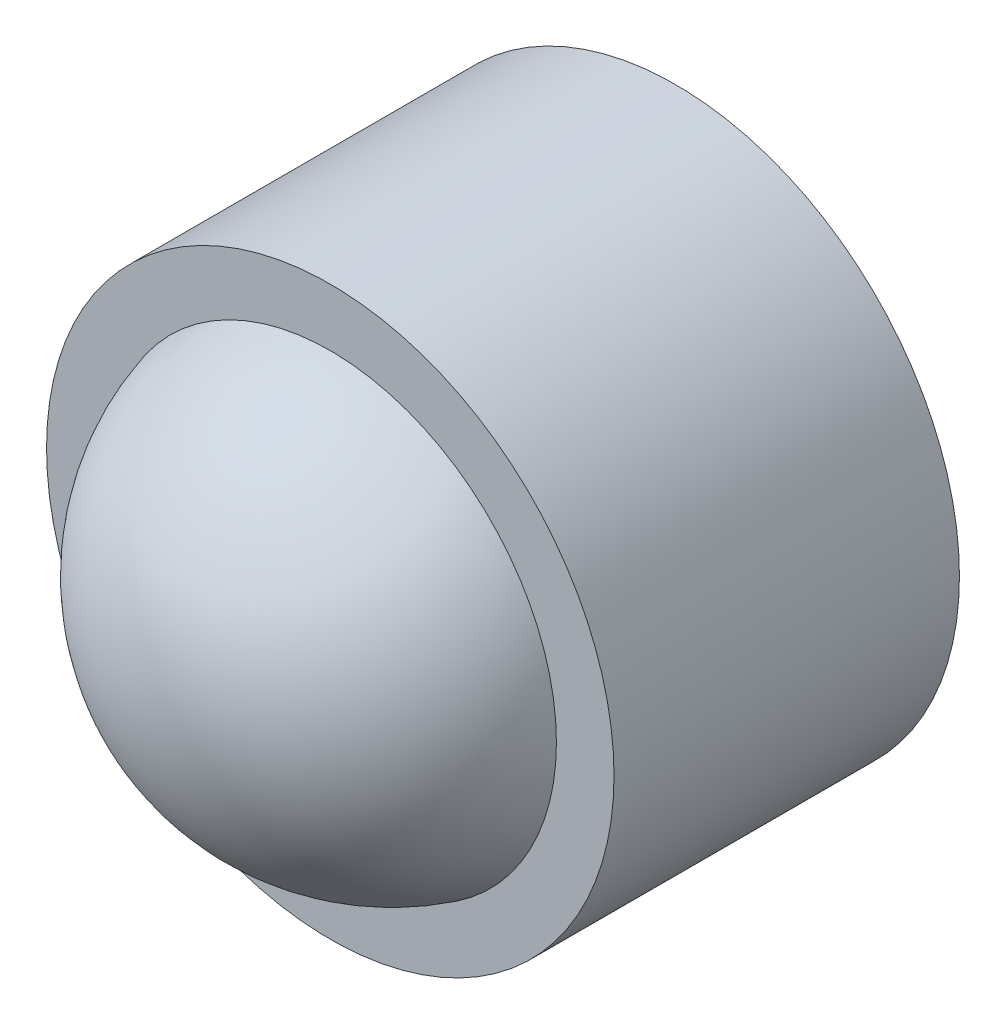
ISO-10303-21;
HEADER;
FILE_DESCRIPTION(('STEP AP214'),'2;1');
FILE_NAME('part.step','',(''),(''),'','','');
FILE_SCHEMA(('AUTOMOTIVE_DESIGN { 1 0 10303 214 1 1 1 1 }'));
ENDSEC;
DATA;
#1=APPLICATION_CONTEXT('core data for automotive mechanical design processes');
#2=APPLICATION_PROTOCOL_DEFINITION('international standard','automotive_design',2000,#1);
#3=PRODUCT_CONTEXT('',#1,'mechanical');
#4=PRODUCT('Part','Part','',(#3));
#5=PRODUCT_RELATED_PRODUCT_CATEGORY('part','',(#4));
#6=PRODUCT_DEFINITION_FORMATION('','',#4);
#7=PRODUCT_DEFINITION_CONTEXT('part definition',#1,'design');
#8=PRODUCT_DEFINITION('design','',#6,#7);
#9=PRODUCT_DEFINITION_SHAPE('','',#8);
#10=(LENGTH_UNIT() NAMED_UNIT(*) SI_UNIT(.MILLI.,.METRE.));
#11=(NAMED_UNIT(*) PLANE_ANGLE_UNIT() SI_UNIT($,.RADIAN.));
#12=(NAMED_UNIT(*) SI_UNIT($,.STERADIAN.) SOLID_ANGLE_UNIT());
#13=UNCERTAINTY_MEASURE_WITH_UNIT(LENGTH_MEASURE(1.E-05),#10,'distance_accuracy_value','');
#14=(GEOMETRIC_REPRESENTATION_CONTEXT(3) GLOBAL_UNCERTAINTY_ASSIGNED_CONTEXT((#13)) GLOBAL_UNIT_ASSIGNED_CONTEXT((#10,
#11,#12)) REPRESENTATION_CONTEXT('',''));
#15=CARTESIAN_POINT('',(0.,0.,0.));
#16=DIRECTION('',(0.,0.,1.));
#17=DIRECTION('',(1.,0.,0.));
#18=AXIS2_PLACEMENT_3D('',#15,#16,#17);
#19=CARTESIAN_POINT('',(8.,0.,14.));
#20=DIRECTION('',(0.,0.,-1.));
#21=DIRECTION('',(-1.,0.,0.));
#22=AXIS2_PLACEMENT_3D('',#19,#20,#21);
#23=CYLINDRICAL_SURFACE('',#22,1.);
#24=CARTESIAN_POINT('',(7.26614909429952,-0.679310646424684,5.41792688495915));
#25=CARTESIAN_POINT('',(7.23726780048955,-0.648112009411069,5.37993831193802));
#26=CARTESIAN_POINT('',(7.20935422207309,-0.613983687752235,5.34358089975345));
#27=CARTESIAN_POINT('',(7.15663596354548,-0.539277748680729,5.2754533024846));
#28=CARTESIAN_POINT('',(7.13182787479878,-0.498707315227192,5.24367808198344));
#29=CARTESIAN_POINT('',(7.09248645265815,-0.421666163807222,5.19359974926243));
#30=CARTESIAN_POINT('',(7.0769259052674,-0.386634560230069,5.17390438939157));
#31=CARTESIAN_POINT('',(7.04943241987194,-0.312984544177243,5.13923100197879));
#32=CARTESIAN_POINT('',(7.03749441362285,-0.27437124255281,5.1242463826412));
#33=CARTESIAN_POINT('',(7.01963813902374,-0.200290996100601,5.10188336563008));
#34=CARTESIAN_POINT('',(7.01308509177327,-0.16522236443783,5.09370064851561));
#35=CARTESIAN_POINT('',(7.00376084453511,-0.0938142404546288,5.08206720860586));
#36=CARTESIAN_POINT('',(7.00098764560793,-0.0574754302941476,5.07861398465509));
#37=CARTESIAN_POINT('',(6.99945321245175,0.0154844581887679,5.07670258044163));
#38=CARTESIAN_POINT('',(7.00069902267907,0.0521059197717665,5.07825317078781));
#39=CARTESIAN_POINT('',(7.00710991874158,0.124457913408874,5.08624473894219));
#40=CARTESIAN_POINT('',(7.01227625675077,0.160188157051061,5.09268727918647));
#41=CARTESIAN_POINT('',(7.0259973684854,0.229208763859698,5.10984249934711));
#42=CARTESIAN_POINT('',(7.03449081033247,0.262531032579709,5.12047790940096));
#43=CARTESIAN_POINT('',(7.05432668093742,0.326859686755468,5.14540098706284));
#44=CARTESIAN_POINT('',(7.06567024656096,0.357865141655611,5.15969011211567));
#45=CARTESIAN_POINT('',(7.09721303966084,0.43288623393439,5.19958998102426));
#46=CARTESIAN_POINT('',(7.1189363012805,0.475195188435896,5.22720780004272));
#47=CARTESIAN_POINT('',(7.16602516955042,0.553708544014347,5.28755159482906));
#48=CARTESIAN_POINT('',(7.19140010460618,0.589896778001268,5.32029067236299));
#49=CARTESIAN_POINT('',(7.25844522202304,0.674035353806611,5.40757568515001));
#50=CARTESIAN_POINT('',(7.301680441207,0.718196561427157,5.46455136869222));
#51=CARTESIAN_POINT('',(7.39074804835355,0.795162867632641,5.58378395988812));
#52=CARTESIAN_POINT('',(7.43658489969596,0.827947718872208,5.646050040639));
#53=CARTESIAN_POINT('',(7.5208017755078,0.878820076903156,5.76241170371914));
#54=CARTESIAN_POINT('',(7.55902762702011,0.898494416338718,5.81594279134575));
#55=CARTESIAN_POINT('',(7.63557174828479,0.932169351904064,5.92471353304836));
#56=CARTESIAN_POINT('',(7.67389006067481,0.94616641865268,5.97995422703906));
#57=CARTESIAN_POINT('',(7.78852838559625,0.980651175793512,6.14780093609773));
#58=CARTESIAN_POINT('',(7.86438343391884,0.993549960290183,6.26232758355151));
#59=CARTESIAN_POINT('',(7.99399892328887,1.00151948879127,6.46476710627935));
#60=CARTESIAN_POINT('',(8.04851477719859,1.00026049030754,6.55212275899683));
#61=CARTESIAN_POINT('',(8.15524081618739,0.989333352913162,6.72780414440994));
#62=CARTESIAN_POINT('',(8.20744951356073,0.979659868957322,6.81613045846976));
#63=CARTESIAN_POINT('',(8.30899401352151,0.952511474221279,6.99290619963588));
#64=CARTESIAN_POINT('',(8.35833685228148,0.935056669965352,7.08135472747223));
#65=CARTESIAN_POINT('',(8.45396169973278,0.892556819047089,7.25801906095499));
#66=CARTESIAN_POINT('',(8.5002457107127,0.867516798784979,7.34623498181044));
#67=CARTESIAN_POINT('',(8.58397059947568,0.813113485508138,7.51096495494644));
#68=CARTESIAN_POINT('',(8.62179891735037,0.784660927670339,7.5875835827832));
#69=CARTESIAN_POINT('',(8.69472154200664,0.720920012373368,7.73964995193591));
#70=CARTESIAN_POINT('',(8.72980767873107,0.685612243722986,7.81509369523522));
#71=CARTESIAN_POINT('',(8.78010472008384,0.626190985006641,7.92652341433148));
#72=CARTESIAN_POINT('',(8.79657277892121,0.605162173935273,7.96359307598492));
#73=CARTESIAN_POINT('',(8.82852778012879,0.560620041924152,8.03663677632882));
#74=CARTESIAN_POINT('',(8.84401523241025,0.537108029494453,8.07261137930685));
#75=CARTESIAN_POINT('',(8.87377325799362,0.487197935070467,8.14279074543941));
#76=CARTESIAN_POINT('',(8.88804876941139,0.460812674830816,8.17700244281674));
#77=CARTESIAN_POINT('',(8.91512734029256,0.404378581309218,8.2428482788224));
#78=CARTESIAN_POINT('',(8.92793367476944,0.374338216716124,8.27448810272966));
#79=CARTESIAN_POINT('',(8.94838086311012,0.318141562535612,8.32566865150164));
#80=CARTESIAN_POINT('',(8.95649114792428,0.293066294198391,8.34619345292506));
#81=CARTESIAN_POINT('',(8.97117249844947,0.239956112815517,8.38365795725859));
#82=CARTESIAN_POINT('',(8.97774801626895,0.211930111421472,8.4006080157644));
#83=CARTESIAN_POINT('',(8.98690143053205,0.162572578579828,8.42434237468236));
#84=CARTESIAN_POINT('',(8.99008232822049,0.142088696484225,8.43263509677796));
#85=CARTESIAN_POINT('',(8.9952173356733,0.0999552008218125,8.44605697479058));
#86=CARTESIAN_POINT('',(8.99717289539629,0.0783069980896262,8.45118986964627));
#87=CARTESIAN_POINT('',(8.99966129917096,0.0341794902977633,8.45772600754511));
#88=CARTESIAN_POINT('',(9.00018285862771,0.0116949965308799,8.45909966760779));
#89=CARTESIAN_POINT('',(8.99970211226999,-0.0331450134664918,8.4578352389366));
#90=CARTESIAN_POINT('',(8.99869955678297,-0.0555005079627689,8.45519649291129));
#91=CARTESIAN_POINT('',(8.99546404506725,-0.0971943545942594,8.44670829609337));
#92=CARTESIAN_POINT('',(8.99336030572656,-0.116614621798573,8.44119624801359));
#93=CARTESIAN_POINT('',(8.98818863670166,-0.154427421353949,8.42769994900572));
#94=CARTESIAN_POINT('',(8.98512027261181,-0.172819486264193,8.41971458427709));
#95=CARTESIAN_POINT('',(8.97557519041553,-0.221977213806911,8.39499739798477));
#96=CARTESIAN_POINT('',(8.96827833227168,-0.251549398806938,8.37622500210386));
#97=CARTESIAN_POINT('',(8.95202586610275,-0.307406609875433,8.33487480178867));
#98=CARTESIAN_POINT('',(8.94306409761842,-0.333678799666818,8.31228289337112));
#99=CARTESIAN_POINT('',(8.92392296901234,-0.383509662607191,8.2646015169597));
#100=CARTESIAN_POINT('',(8.91373928077178,-0.407058073081229,8.23950322716801));
#101=CARTESIAN_POINT('',(8.8924452444782,-0.451835088845084,8.18766669679347));
#102=CARTESIAN_POINT('',(8.881333943276,-0.473061254922637,8.16092677704071));
#103=CARTESIAN_POINT('',(8.84683735907359,-0.533905339509559,8.07895102540735));
#104=CARTESIAN_POINT('',(8.82232097273286,-0.570612531770879,8.02203848933186));
#105=CARTESIAN_POINT('',(8.76756247426072,-0.642771438162312,7.89814546364919));
#106=CARTESIAN_POINT('',(8.7369937265833,-0.677390670967806,7.83084019725269));
#107=CARTESIAN_POINT('',(8.67333743816285,-0.740694656789546,7.69457601891092));
#108=CARTESIAN_POINT('',(8.64024718257557,-0.769372886173689,7.62561538096802));
#109=CARTESIAN_POINT('',(8.57179900714023,-0.82152121205503,7.4867663509803));
#110=CARTESIAN_POINT('',(8.53643857587696,-0.844985407883215,7.41687700172508));
#111=CARTESIAN_POINT('',(8.46366158812085,-0.887007566904843,7.27669207028179));
#112=CARTESIAN_POINT('',(8.42624479231107,-0.905564957584252,7.20639644166696));
#113=CARTESIAN_POINT('',(8.34518062380452,-0.939678913412032,7.05778937677553));
#114=CARTESIAN_POINT('',(8.30130670446102,-0.954660289025523,6.9794688156466));
#115=CARTESIAN_POINT('',(8.21141557470374,-0.978501852356758,6.82309202590976));
#116=CARTESIAN_POINT('',(8.16539769559516,-0.987360116465565,6.74503588802839));
#117=CARTESIAN_POINT('',(8.07153177774536,-0.998556404223144,6.58965206996921));
#118=CARTESIAN_POINT('',(8.02368574314308,-1.00090137140326,6.51232370169388));
#119=CARTESIAN_POINT('',(7.92649283018162,-0.99847798893105,6.35879256658678));
#120=CARTESIAN_POINT('',(7.87714674351371,-0.993713329841709,6.28258923648778));
#121=CARTESIAN_POINT('',(7.76198310862666,-0.973523463645757,6.10852946035286));
#122=CARTESIAN_POINT('',(7.69576343459159,-0.955272412911971,6.01121449055692));
#123=CARTESIAN_POINT('',(7.59644064354874,-0.915641366720048,5.86890690076534));
#124=CARTESIAN_POINT('',(7.56337539401584,-0.9004151956673,5.82213789457796));
#125=CARTESIAN_POINT('',(7.49754551509296,-0.865407688680087,5.730131722479));
#126=CARTESIAN_POINT('',(7.46478070114485,-0.845629375619061,5.68489356276644));
#127=CARTESIAN_POINT('',(7.40380618984153,-0.803590428765685,5.60164212900351));
#128=CARTESIAN_POINT('',(7.37551421749891,-0.781895872393073,5.56340514179757));
#129=CARTESIAN_POINT('',(7.31992622420529,-0.734060709929665,5.48896304833285));
#130=CARTESIAN_POINT('',(7.29263086173034,-0.70791722669042,5.45275927724717));
#131=CARTESIAN_POINT('',(7.26614909429952,-0.679310646424684,5.41792688495915));
#132=B_SPLINE_CURVE_WITH_KNOTS('',3,(#24,#25,#26,#27,#28,#29,#30,#31,#32,#33,#34,#35,#36,#37,
#38,#39,#40,#41,#42,#43,#44,#45,#46,#47,#48,#49,#50,#51,#52,#53,#54,#55,#56,#57,#58,#59,#60,#61,
#62,#63,#64,#65,#66,#67,#68,#69,#70,#71,#72,#73,#74,#75,#76,#77,#78,#79,#80,#81,#82,#83,#84,#85,
#86,#87,#88,#89,#90,#91,#92,#93,#94,#95,#96,#97,#98,#99,#100,#101,#102,#103,#104,#105,#106,#107,
#108,#109,#110,#111,#112,#113,#114,#115,#116,#117,#118,#119,#120,#121,#122,#123,#124,#125,#126,
#127,#128,#129,#130,#131),.UNSPECIFIED.,.T.,.F.,(4,2,2,2,2,2,2,2,2,2,2,2,2,2,2,2,2,2,2,2,2,2,2,
2,2,2,2,2,2,2,2,2,2,2,2,2,2,2,2,2,2,2,2,2,2,2,2,2,2,2,2,2,2,4),(0.,0.170942119162799,
0.341694932928776,0.470523566695406,0.599171118224239,0.70849918156759,0.817769405264902,
0.927231260092028,1.03672809056895,1.14429486079418,1.25190460587267,1.41596070854968,
1.58044359683964,1.83121638771323,2.08243323549472,2.2881194806978,2.49393339928046,
2.90634854210784,3.2149546093461,3.52375685244721,3.83176575048752,4.13957098895994,
4.40951200908113,4.68022884445586,4.81723115229697,4.95416162431265,5.09050431876862,
5.22653692368353,5.32651279213756,5.42619493890226,5.49294153687961,5.55960900282361,
5.62679961436731,5.69400123391237,5.75466378644214,5.81535369675566,5.92206708109958,
6.02918348569272,6.13669117220027,6.24431071866351,6.4598901972256,6.70445692571205,
6.94929079829991,7.19440035155034,7.43953849097725,7.71234782482906,7.98524282431974,
8.25784679092778,8.53030929972361,8.88649247794091,9.06414156698223,9.24167302586519,
9.39831118186806,9.55505102439682),.UNSPECIFIED.);
#133=CARTESIAN_POINT('',(7.26614909429952,-0.679310646424684,5.41792688495915));
#134=VERTEX_POINT('',#133);
#135=EDGE_CURVE('E10',#134,#134,#132,.T.);
#136=ORIENTED_EDGE('',*,*,#135,.F.);
#137=EDGE_LOOP('',(#136));
#138=FACE_BOUND('',#137,.T.);
#139=CARTESIAN_POINT('',(8.,0.,0.));
#140=DIRECTION('',(0.,0.,1.));
#141=DIRECTION('',(1.,0.,0.));
#142=AXIS2_PLACEMENT_3D('',#139,#140,#141);
#143=CIRCLE('',#142,1.);
#144=CARTESIAN_POINT('',(9.,0.,0.));
#145=VERTEX_POINT('',#144);
#146=EDGE_CURVE('E90',#145,#145,#143,.T.);
#147=ORIENTED_EDGE('',*,*,#146,.F.);
#148=EDGE_LOOP('',(#147));
#149=FACE_BOUND('',#148,.T.);
#150=ADVANCED_FACE('F34',(#138,#149),#23,.F.);
#151=CARTESIAN_POINT('',(-8.,0.,14.));
#152=DIRECTION('',(0.,0.,-1.));
#153=DIRECTION('',(-1.,0.,0.));
#154=AXIS2_PLACEMENT_3D('',#151,#152,#153);
#155=CYLINDRICAL_SURFACE('',#154,1.);
#156=CARTESIAN_POINT('',(-8.13566196754564,-0.990755181950691,6.69589669977115));
#157=CARTESIAN_POINT('',(-8.18981697099314,-0.983334899611757,6.78607369006732));
#158=CARTESIAN_POINT('',(-8.2426588856913,-0.971598402630382,6.8766141485104));
#159=CARTESIAN_POINT('',(-8.3453997405068,-0.939994403094647,7.05795017582243));
#160=CARTESIAN_POINT('',(-8.3952992466983,-0.920128470396175,7.14874569207773));
#161=CARTESIAN_POINT('',(-8.49191321033121,-0.872315133607974,7.33015100824301));
#162=CARTESIAN_POINT('',(-8.5386207356712,-0.844350790811757,7.42076001382058));
#163=CARTESIAN_POINT('',(-8.62834425126755,-0.779900633485802,7.60069873518818));
#164=CARTESIAN_POINT('',(-8.67136465245439,-0.743425201021809,7.69002986997701));
#165=CARTESIAN_POINT('',(-8.73199282749636,-0.681886579683887,7.82033662770321));
#166=CARTESIAN_POINT('',(-8.75122437570918,-0.660694346002891,7.86239865322664));
#167=CARTESIAN_POINT('',(-8.78859572973286,-0.615610493857451,7.94553928945624));
#168=CARTESIAN_POINT('',(-8.80673604930723,-0.591720161178908,7.98661835737671));
#169=CARTESIAN_POINT('',(-8.84168655263237,-0.540844599021451,8.06712532946181));
#170=CARTESIAN_POINT('',(-8.8585023973938,-0.51387390169594,8.10655987892158));
#171=CARTESIAN_POINT('',(-8.89059034035505,-0.45600989785048,8.18307258818209));
#172=CARTESIAN_POINT('',(-8.90586524305963,-0.425123957097905,8.22015498147865));
#173=CARTESIAN_POINT('',(-8.93102341914645,-0.366022134739614,8.28218179336046));
#174=CARTESIAN_POINT('',(-8.94133415151103,-0.338857709386171,8.30794259021324));
#175=CARTESIAN_POINT('',(-8.96023756242358,-0.280839822282816,8.35567790769715));
#176=CARTESIAN_POINT('',(-8.96883559234005,-0.249998348194106,8.37766419113633));
#177=CARTESIAN_POINT('',(-8.98057118239482,-0.197210106275715,8.40791429252159));
#178=CARTESIAN_POINT('',(-8.98452123859324,-0.176595127412272,8.41816019147238));
#179=CARTESIAN_POINT('',(-8.99122671305931,-0.133920627949709,8.43561612646271));
#180=CARTESIAN_POINT('',(-8.99398341233312,-0.11186268573209,8.44282941760695));
#181=CARTESIAN_POINT('',(-8.99805371858132,-0.0664294663071936,8.4534985851759));
#182=CARTESIAN_POINT('',(-8.99935078119552,-0.0430421822560587,8.45691138015983));
#183=CARTESIAN_POINT('',(-9.00026788696272,0.00398858263794831,8.45932312319998));
#184=CARTESIAN_POINT('',(-8.99988907095559,0.0276318782693799,8.45832507390078));
#185=CARTESIAN_POINT('',(-8.9976743115277,0.0711082447428054,8.4525064763727));
#186=CARTESIAN_POINT('',(-8.99604050430568,0.0910272184215054,8.44821627154938));
#187=CARTESIAN_POINT('',(-8.99171485869962,0.129944765423788,8.43689792543872));
#188=CARTESIAN_POINT('',(-8.98902223595348,0.148942644661417,8.4298677544406));
#189=CARTESIAN_POINT('',(-8.98090563147966,0.196757106659567,8.40877447289646));
#190=CARTESIAN_POINT('',(-8.97480926132278,0.224703284610837,8.39301425013005));
#191=CARTESIAN_POINT('',(-8.96105189075735,0.27773241181278,8.35779035043865));
#192=CARTESIAN_POINT('',(-8.95338582645888,0.302805674032783,8.33831470166583));
#193=CARTESIAN_POINT('',(-8.93724046496292,0.349523404581882,8.29772747062087));
#194=CARTESIAN_POINT('',(-8.92880272865546,0.371261509039023,8.27670525766471));
#195=CARTESIAN_POINT('',(-8.91111518107846,0.412767882397677,8.23310006896485));
#196=CARTESIAN_POINT('',(-8.90186458530518,0.432534208143365,8.21051559002566));
#197=CARTESIAN_POINT('',(-8.87310245774635,0.489395493247379,8.14105748075199));
#198=CARTESIAN_POINT('',(-8.85260689321644,0.523981925075903,8.09254582930023));
#199=CARTESIAN_POINT('',(-8.80653132541715,0.592839753238353,7.98592010139325));
#200=CARTESIAN_POINT('',(-8.78064668358894,0.626318741737392,7.92744218799889));
#201=CARTESIAN_POINT('',(-8.7267451148163,0.688127893642232,7.8087115536779));
#202=CARTESIAN_POINT('',(-8.69872581688674,0.71645220984318,7.74845690620243));
#203=CARTESIAN_POINT('',(-8.6407608155338,0.768733153003185,7.62681832564325));
#204=CARTESIAN_POINT('',(-8.61081101422833,0.792680045407615,7.56543220196698));
#205=CARTESIAN_POINT('',(-8.54919389113311,0.83654941107555,7.44208113634039));
#206=CARTESIAN_POINT('',(-8.51752619920674,0.856471012646498,7.38011607205131));
#207=CARTESIAN_POINT('',(-8.43794380360204,0.900617473417731,7.22787938616047));
#208=CARTESIAN_POINT('',(-8.38914496486059,0.922728779541023,7.13744980278662));
#209=CARTESIAN_POINT('',(-8.28849514623932,0.958973609505064,6.9566242780122));
#210=CARTESIAN_POINT('',(-8.23664229471452,0.973102183770172,6.86622839213708));
#211=CARTESIAN_POINT('',(-8.1304088578188,0.992927691928806,6.68631887230453));
#212=CARTESIAN_POINT('',(-8.07603562940649,0.998647746233345,6.59680349392011));
#213=CARTESIAN_POINT('',(-7.9651306580623,1.00092854371961,6.41907517148051));
#214=CARTESIAN_POINT('',(-7.9086008018111,0.997497119630491,6.33086117856599));
#215=CARTESIAN_POINT('',(-7.79160004914664,0.979906892990562,6.15279031947574));
#216=CARTESIAN_POINT('',(-7.73106306150079,0.965307390933328,6.06301797617745));
#217=CARTESIAN_POINT('',(-7.60945199787545,0.922834449742498,5.88693595264095));
#218=CARTESIAN_POINT('',(-7.54837828405748,0.894969373971822,5.80062412781863));
#219=CARTESIAN_POINT('',(-7.44232638264262,0.83176513298716,5.65390726067228));
#220=CARTESIAN_POINT('',(-7.39702128594819,0.799853308206878,5.59227751580168));
#221=CARTESIAN_POINT('',(-7.30886348477054,0.725028911463467,5.47408567636291));
#222=CARTESIAN_POINT('',(-7.26600581648812,0.682139648610307,5.4175131826657));
#223=CARTESIAN_POINT('',(-7.20022987632024,0.601651718901668,5.33173929934213));
#224=CARTESIAN_POINT('',(-7.17577225578247,0.567901637528708,5.30011972343922));
#225=CARTESIAN_POINT('',(-7.12996285366946,0.494861972930347,5.24128980600187));
#226=CARTESIAN_POINT('',(-7.10860688094415,0.455580008912986,5.21407350868868));
#227=CARTESIAN_POINT('',(-7.07433603506148,0.380119931630812,5.17062428808247));
#228=CARTESIAN_POINT('',(-7.06058845442689,0.344965561864562,5.15328367549913));
#229=CARTESIAN_POINT('',(-7.0367878564566,0.271494576888042,5.12335363803343));
#230=CARTESIAN_POINT('',(-7.02673231397358,0.233180145029305,5.11076096566672));
#231=CARTESIAN_POINT('',(-7.01107421622009,0.153855850082919,5.09118484294961));
#232=CARTESIAN_POINT('',(-7.00551191305374,0.112825109101047,5.0842520905147));
#233=CARTESIAN_POINT('',(-6.99958144880467,0.0298195943625788,5.07686118135554));
#234=CARTESIAN_POINT('',(-6.99920930681271,-0.0121544311296405,5.07639806235266));
#235=CARTESIAN_POINT('',(-7.00337104930103,-0.0895646320329303,5.08158381014311));
#236=CARTESIAN_POINT('',(-7.0072306324391,-0.12509906478108,5.08639261470474));
#237=CARTESIAN_POINT('',(-7.01849980576249,-0.194681638505197,5.1004646802992));
#238=CARTESIAN_POINT('',(-7.02591062221879,-0.228729261638598,5.10972948002902));
#239=CARTESIAN_POINT('',(-7.04617233438991,-0.303453582087944,5.13514004342812));
#240=CARTESIAN_POINT('',(-7.0599468292455,-0.343477621679097,5.15246177378426));
#241=CARTESIAN_POINT('',(-7.09125786029199,-0.419382736214027,5.19204732518483));
#242=CARTESIAN_POINT('',(-7.10880076737939,-0.455256634900898,5.21431951774761));
#243=CARTESIAN_POINT('',(-7.15463780908194,-0.537025567861104,5.2728844721039));
#244=CARTESIAN_POINT('',(-7.18433849018163,-0.580729306307284,5.3111200958387));
#245=CARTESIAN_POINT('',(-7.24709751221641,-0.660079709075705,5.39278101028783));
#246=CARTESIAN_POINT('',(-7.28016271248778,-0.695709415666356,5.43621693615461));
#247=CARTESIAN_POINT('',(-7.36834147533778,-0.778819184001323,5.55343107412843));
#248=CARTESIAN_POINT('',(-7.42492371340655,-0.82083519133449,5.62995437899854));
#249=CARTESIAN_POINT('',(-7.53953052192053,-0.890201034433819,5.78827267195123));
#250=CARTESIAN_POINT('',(-7.59755765976397,-0.917522475088927,5.87007752681872));
#251=CARTESIAN_POINT('',(-7.69667414523772,-0.953896512797574,6.01303679361152));
#252=CARTESIAN_POINT('',(-7.73785687497101,-0.965939932954131,6.0733987850328));
#253=CARTESIAN_POINT('',(-7.81965467181961,-0.984496933085613,6.19535569029623));
#254=CARTESIAN_POINT('',(-7.86026951807636,-0.991008417381138,6.25695106234687));
#255=CARTESIAN_POINT('',(-7.98086750354685,-1.0030865092388,6.44317388566024));
#256=CARTESIAN_POINT('',(-8.05956121261337,-1.00118245647484,6.56917642274797));
#257=CARTESIAN_POINT('',(-8.13566196754564,-0.990755181950691,6.69589669977115));
#258=B_SPLINE_CURVE_WITH_KNOTS('',3,(#156,#157,#158,#159,#160,#161,#162,#163,#164,#165,#166,
#167,#168,#169,#170,#171,#172,#173,#174,#175,#176,#177,#178,#179,#180,#181,#182,#183,#184,#185,
#186,#187,#188,#189,#190,#191,#192,#193,#194,#195,#196,#197,#198,#199,#200,#201,#202,#203,#204,
#205,#206,#207,#208,#209,#210,#211,#212,#213,#214,#215,#216,#217,#218,#219,#220,#221,#222,#223,
#224,#225,#226,#227,#228,#229,#230,#231,#232,#233,#234,#235,#236,#237,#238,#239,#240,#241,#242,
#243,#244,#245,#246,#247,#248,#249,#250,#251,#252,#253,#254,#255,#256,#257),.UNSPECIFIED.,.T.,
.F.,(4,2,2,2,2,2,2,2,2,2,2,2,2,2,2,2,2,2,2,2,2,2,2,2,2,2,2,2,2,2,2,2,2,2,2,2,2,2,2,2,2,2,2,2,2,
2,2,2,2,2,4),(0.,0.316162661536983,0.632264298447906,0.949031931472153,1.26541516402335,
1.41796871126408,1.57044986307414,1.72223926134607,1.87374722157961,1.98999504359128,
2.10587374456218,2.17573304833205,2.24551717471396,2.31608454924039,2.38660389303151,
2.44767006577884,2.50878156133993,2.60619126732965,2.7039203167843,2.79796453789357,
2.89210054098093,3.08067201235234,3.29694044608614,3.51345269533057,3.73044071960156,
3.9474756832398,4.26242911751083,4.57757762033211,4.89185794644499,5.2058693670999,
5.53295505580959,5.85983480386571,6.10781691919564,6.35527678419226,6.51179121994737,
6.66809215512593,6.79224093585347,6.91630464689707,7.04146781105638,7.1665349684432,
7.27422941021173,7.38196106661164,7.51841412301665,7.65509970916334,7.84967957596278,
8.04466440358159,8.35503225380591,8.665997709398,8.88794221724223,9.10997076752703,
9.55425505693133),.UNSPECIFIED.);
#259=CARTESIAN_POINT('',(-8.13566196754564,-0.990755181950691,6.69589669977115));
#260=VERTEX_POINT('',#259);
#261=EDGE_CURVE('E43',#260,#260,#258,.T.);
#262=ORIENTED_EDGE('',*,*,#261,.F.);
#263=EDGE_LOOP('',(#262));
#264=FACE_BOUND('',#263,.T.);
#265=CARTESIAN_POINT('',(-8.,0.,0.));
#266=DIRECTION('',(0.,0.,1.));
#267=DIRECTION('',(1.,0.,0.));
#268=AXIS2_PLACEMENT_3D('',#265,#266,#267);
#269=CIRCLE('',#268,1.);
#270=CARTESIAN_POINT('',(-7.,0.,0.));
#271=VERTEX_POINT('',#270);
#272=EDGE_CURVE('E93',#271,#271,#269,.T.);
#273=ORIENTED_EDGE('',*,*,#272,.F.);
#274=EDGE_LOOP('',(#273));
#275=FACE_BOUND('',#274,.T.);
#276=ADVANCED_FACE('F36',(#264,#275),#155,.F.);
#277=CARTESIAN_POINT('',(0.,0.,14.));
#278=DIRECTION('',(0.,0.,-1.));
#279=DIRECTION('',(-1.,0.,0.));
#280=AXIS2_PLACEMENT_3D('',#277,#278,#279);
#281=CYLINDRICAL_SURFACE('',#280,11.5);
#282=CARTESIAN_POINT('',(0.,0.,14.));
#283=DIRECTION('',(0.,0.,1.));
#284=DIRECTION('',(1.,0.,0.));
#285=AXIS2_PLACEMENT_3D('',#282,#283,#284);
#286=CIRCLE('',#285,11.5);
#287=CARTESIAN_POINT('',(11.5,0.,14.));
#288=VERTEX_POINT('',#287);
#289=EDGE_CURVE('E55',#288,#288,#286,.T.);
#290=ORIENTED_EDGE('',*,*,#289,.F.);
#291=EDGE_LOOP('',(#290));
#292=FACE_BOUND('',#291,.T.);
#293=CARTESIAN_POINT('',(0.,0.,0.));
#294=DIRECTION('',(0.,0.,1.));
#295=DIRECTION('',(1.,0.,0.));
#296=AXIS2_PLACEMENT_3D('',#293,#294,#295);
#297=CIRCLE('',#296,11.5);
#298=CARTESIAN_POINT('',(11.5,0.,0.));
#299=VERTEX_POINT('',#298);
#300=EDGE_CURVE('E92',#299,#299,#297,.T.);
#301=ORIENTED_EDGE('',*,*,#300,.T.);
#302=EDGE_LOOP('',(#301));
#303=FACE_BOUND('',#302,.T.);
#304=ADVANCED_FACE('F71',(#292,#303),#281,.T.);
#305=CARTESIAN_POINT('',(0.,0.,14.));
#306=DIRECTION('',(0.,0.,1.));
#307=DIRECTION('',(1.,0.,0.));
#308=AXIS2_PLACEMENT_3D('',#305,#306,#307);
#309=PLANE('',#308);
#310=CARTESIAN_POINT('',(0.,0.,14.));
#311=DIRECTION('',(0.,0.,1.));
#312=DIRECTION('',(1.,0.,0.));
#313=AXIS2_PLACEMENT_3D('',#310,#311,#312);
#314=CIRCLE('',#313,9.16515138991168);
#315=CARTESIAN_POINT('',(9.16515138991168,0.,14.));
#316=VERTEX_POINT('',#315);
#317=EDGE_CURVE('E39',#316,#316,#314,.T.);
#318=ORIENTED_EDGE('',*,*,#317,.F.);
#319=EDGE_LOOP('',(#318));
#320=FACE_BOUND('',#319,.T.);
#321=ORIENTED_EDGE('',*,*,#289,.T.);
#322=EDGE_LOOP('',(#321));
#323=FACE_BOUND('',#322,.T.);
#324=ADVANCED_FACE('F67',(#320,#323),#309,.T.);
#325=CARTESIAN_POINT('',(0.,0.,0.));
#326=DIRECTION('',(0.,0.,1.));
#327=DIRECTION('',(1.,0.,0.));
#328=AXIS2_PLACEMENT_3D('',#325,#326,#327);
#329=PLANE('',#328);
#330=ORIENTED_EDGE('',*,*,#272,.T.);
#331=EDGE_LOOP('',(#330));
#332=FACE_BOUND('',#331,.T.);
#333=ORIENTED_EDGE('',*,*,#146,.T.);
#334=EDGE_LOOP('',(#333));
#335=FACE_BOUND('',#334,.T.);
#336=ORIENTED_EDGE('',*,*,#300,.F.);
#337=EDGE_LOOP('',(#336));
#338=FACE_BOUND('',#337,.T.);
#339=ADVANCED_FACE('F64',(#332,#335,#338),#329,.F.);
#340=CARTESIAN_POINT('',(0.,0.,11.5));
#341=DIRECTION('',(0.,0.,-1.));
#342=DIRECTION('',(1.,0.,0.));
#343=AXIS2_PLACEMENT_3D('',#340,#341,#342);
#344=SPHERICAL_SURFACE('',#343,9.5);
#345=ORIENTED_EDGE('',*,*,#317,.T.);
#346=EDGE_LOOP('',(#345));
#347=FACE_BOUND('',#346,.T.);
#348=ADVANCED_FACE('F59',(#347),#344,.T.);
#349=ORIENTED_EDGE('',*,*,#261,.T.);
#350=EDGE_LOOP('',(#349));
#351=FACE_BOUND('',#350,.T.);
#352=ADVANCED_FACE('F63',(#351),#344,.T.);
#353=ORIENTED_EDGE('',*,*,#135,.T.);
#354=EDGE_LOOP('',(#353));
#355=FACE_BOUND('',#354,.T.);
#356=ADVANCED_FACE('F66',(#355),#344,.T.);
#357=CLOSED_SHELL('',(#150,#276,#304,#324,#339,#348,#352,#356));
#358=MANIFOLD_SOLID_BREP('B2',#357);
#359=ADVANCED_BREP_SHAPE_REPRESENTATION('',(#18,#358),#14);
#360=SHAPE_DEFINITION_REPRESENTATION(#9,#359);
ENDSEC;
END-ISO-10303-21;
